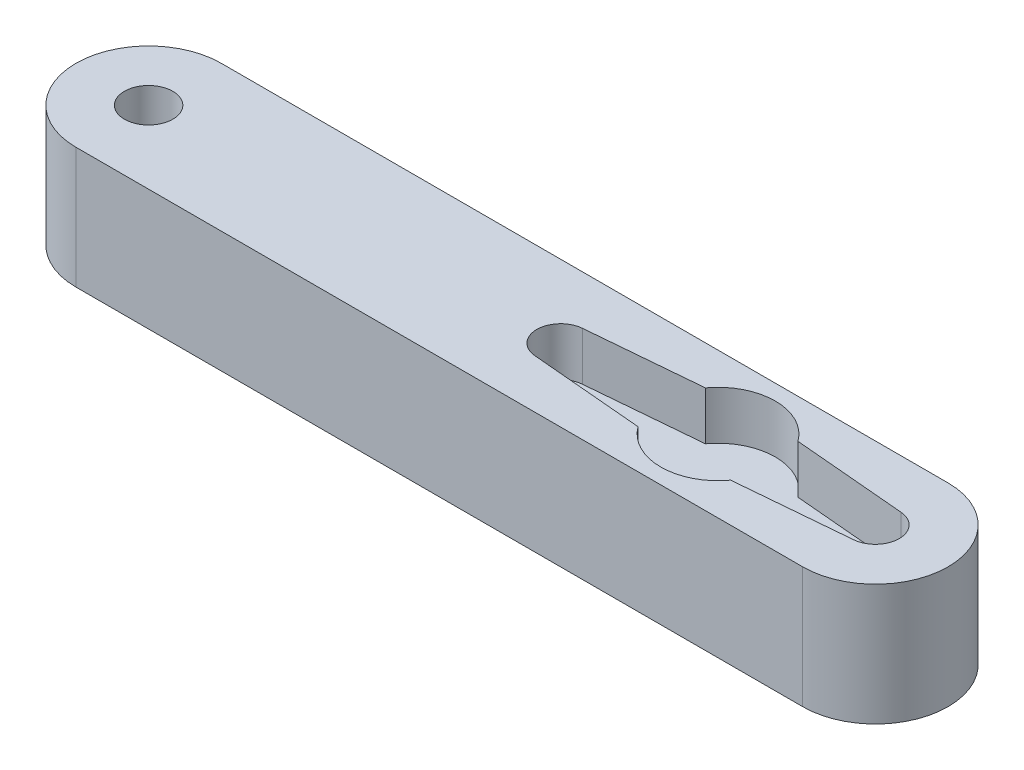
ISO-10303-21;
HEADER;
FILE_DESCRIPTION(('STEP AP214'),'2;1');
FILE_NAME('part.step','',(''),(''),'','','');
FILE_SCHEMA(('AUTOMOTIVE_DESIGN { 1 0 10303 214 1 1 1 1 }'));
ENDSEC;
DATA;
#1=APPLICATION_CONTEXT('core data for automotive mechanical design processes');
#2=APPLICATION_PROTOCOL_DEFINITION('international standard','automotive_design',2000,#1);
#3=PRODUCT_CONTEXT('',#1,'mechanical');
#4=PRODUCT('Part','Part','',(#3));
#5=PRODUCT_RELATED_PRODUCT_CATEGORY('part','',(#4));
#6=PRODUCT_DEFINITION_FORMATION('','',#4);
#7=PRODUCT_DEFINITION_CONTEXT('part definition',#1,'design');
#8=PRODUCT_DEFINITION('design','',#6,#7);
#9=PRODUCT_DEFINITION_SHAPE('','',#8);
#10=(LENGTH_UNIT() NAMED_UNIT(*) SI_UNIT(.MILLI.,.METRE.));
#11=(NAMED_UNIT(*) PLANE_ANGLE_UNIT() SI_UNIT($,.RADIAN.));
#12=(NAMED_UNIT(*) SI_UNIT($,.STERADIAN.) SOLID_ANGLE_UNIT());
#13=UNCERTAINTY_MEASURE_WITH_UNIT(LENGTH_MEASURE(1.E-05),#10,'distance_accuracy_value','');
#14=(GEOMETRIC_REPRESENTATION_CONTEXT(3) GLOBAL_UNCERTAINTY_ASSIGNED_CONTEXT((#13)) GLOBAL_UNIT_ASSIGNED_CONTEXT((#10,
#11,#12)) REPRESENTATION_CONTEXT('',''));
#15=CARTESIAN_POINT('',(0.,0.,0.));
#16=DIRECTION('',(0.,0.,1.));
#17=DIRECTION('',(1.,0.,0.));
#18=AXIS2_PLACEMENT_3D('',#15,#16,#17);
#19=CARTESIAN_POINT('',(-31.75,12.7,0.));
#20=DIRECTION('',(0.,1.,0.));
#21=DIRECTION('',(0.,0.,1.));
#22=AXIS2_PLACEMENT_3D('',#19,#20,#21);
#23=PLANE('',#22);
#24=CARTESIAN_POINT('',(-31.75,12.7,0.));
#25=DIRECTION('',(0.,1.,0.));
#26=DIRECTION('',(0.,0.,1.));
#27=AXIS2_PLACEMENT_3D('',#24,#25,#26);
#28=CIRCLE('',#27,2.54);
#29=CARTESIAN_POINT('',(-31.75,12.7,2.54));
#30=VERTEX_POINT('',#29);
#31=EDGE_CURVE('E161',#30,#30,#28,.T.);
#32=ORIENTED_EDGE('',*,*,#31,.F.);
#33=EDGE_LOOP('',(#32));
#34=FACE_BOUND('',#33,.T.);
#35=CARTESIAN_POINT('',(-31.75,12.7,0.));
#36=DIRECTION('',(0.,1.,0.));
#37=DIRECTION('',(0.,0.,1.));
#38=AXIS2_PLACEMENT_3D('',#35,#36,#37);
#39=CIRCLE('',#38,7.62);
#40=CARTESIAN_POINT('',(-31.75,12.7,-7.62));
#41=VERTEX_POINT('',#40);
#42=CARTESIAN_POINT('',(-31.75,12.7,7.62));
#43=VERTEX_POINT('',#42);
#44=EDGE_CURVE('E174',#41,#43,#39,.T.);
#45=ORIENTED_EDGE('',*,*,#44,.T.);
#46=DIRECTION('',(1.,0.,0.));
#47=VECTOR('',#46,1.);
#48=CARTESIAN_POINT('',(-31.75,12.7,7.62));
#49=LINE('',#48,#47);
#50=CARTESIAN_POINT('',(44.45,12.7,7.62));
#51=VERTEX_POINT('',#50);
#52=EDGE_CURVE('E93',#43,#51,#49,.T.);
#53=ORIENTED_EDGE('',*,*,#52,.T.);
#54=CARTESIAN_POINT('',(44.45,12.7,0.));
#55=DIRECTION('',(0.,1.,0.));
#56=DIRECTION('',(0.,0.,1.));
#57=AXIS2_PLACEMENT_3D('',#54,#55,#56);
#58=CIRCLE('',#57,7.62);
#59=CARTESIAN_POINT('',(44.45,12.7,-7.62));
#60=VERTEX_POINT('',#59);
#61=EDGE_CURVE('E177',#51,#60,#58,.T.);
#62=ORIENTED_EDGE('',*,*,#61,.T.);
#63=DIRECTION('',(-1.,0.,0.));
#64=VECTOR('',#63,1.);
#65=CARTESIAN_POINT('',(-31.75,12.7,-7.62));
#66=LINE('',#65,#64);
#67=EDGE_CURVE('E65',#60,#41,#66,.T.);
#68=ORIENTED_EDGE('',*,*,#67,.T.);
#69=EDGE_LOOP('',(#45,#53,#62,#68));
#70=FACE_BOUND('',#69,.T.);
#71=DIRECTION('',(-0.996194698091746,0.,-0.0871557427476515));
#72=VECTOR('',#71,1.);
#73=CARTESIAN_POINT('',(44.6678893568691,12.7,-2.49048674522936));
#74=LINE('',#73,#72);
#75=CARTESIAN_POINT('',(44.6678893568691,12.7,-2.49048674522937));
#76=VERTEX_POINT('',#75);
#77=CARTESIAN_POINT('',(32.8027652632598,12.7,-3.52855059474841));
#78=VERTEX_POINT('',#77);
#79=EDGE_CURVE('E156',#76,#78,#74,.T.);
#80=ORIENTED_EDGE('',*,*,#79,.F.);
#81=CARTESIAN_POINT('',(44.45,12.7,0.));
#82=DIRECTION('',(0.,-1.,0.));
#83=DIRECTION('',(0.,0.,-1.));
#84=AXIS2_PLACEMENT_3D('',#81,#82,#83);
#85=CIRCLE('',#84,2.5);
#86=CARTESIAN_POINT('',(44.6678893568691,12.7,2.49048674522936));
#87=VERTEX_POINT('',#86);
#88=EDGE_CURVE('E56',#76,#87,#85,.T.);
#89=ORIENTED_EDGE('',*,*,#88,.T.);
#90=DIRECTION('',(-0.996194698091746,0.,0.0871557427476513));
#91=VECTOR('',#90,1.);
#92=CARTESIAN_POINT('',(44.6678893568691,12.7,2.49048674522936));
#93=LINE('',#92,#91);
#94=CARTESIAN_POINT('',(32.8027652632598,12.7,3.52855059474841));
#95=VERTEX_POINT('',#94);
#96=EDGE_CURVE('E160',#87,#95,#93,.T.);
#97=ORIENTED_EDGE('',*,*,#96,.T.);
#98=CARTESIAN_POINT('',(27.95,12.7,0.));
#99=DIRECTION('',(0.,1.,0.));
#100=DIRECTION('',(0.,0.,1.));
#101=AXIS2_PLACEMENT_3D('',#98,#99,#100);
#102=CIRCLE('',#101,6.);
#103=CARTESIAN_POINT('',(23.0972347367402,12.7,3.5285505947484));
#104=VERTEX_POINT('',#103);
#105=EDGE_CURVE('E377',#104,#95,#102,.T.);
#106=ORIENTED_EDGE('',*,*,#105,.F.);
#107=DIRECTION('',(0.996194698091746,0.,0.0871557427476513));
#108=VECTOR('',#107,1.);
#109=CARTESIAN_POINT('',(11.2321106431309,12.7,2.49048674522936));
#110=LINE('',#109,#108);
#111=CARTESIAN_POINT('',(11.2321106431309,12.7,2.49048674522936));
#112=VERTEX_POINT('',#111);
#113=EDGE_CURVE('E380',#112,#104,#110,.T.);
#114=ORIENTED_EDGE('',*,*,#113,.F.);
#115=CARTESIAN_POINT('',(11.45,12.7,0.));
#116=DIRECTION('',(0.,1.,0.));
#117=DIRECTION('',(0.,0.,1.));
#118=AXIS2_PLACEMENT_3D('',#115,#116,#117);
#119=CIRCLE('',#118,2.5);
#120=CARTESIAN_POINT('',(11.2321106431309,12.7,-2.49048674522936));
#121=VERTEX_POINT('',#120);
#122=EDGE_CURVE('E362',#121,#112,#119,.T.);
#123=ORIENTED_EDGE('',*,*,#122,.F.);
#124=DIRECTION('',(0.996194698091746,0.,-0.0871557427476516));
#125=VECTOR('',#124,1.);
#126=CARTESIAN_POINT('',(11.2321106431309,12.7,-2.49048674522936));
#127=LINE('',#126,#125);
#128=CARTESIAN_POINT('',(23.0972347367402,12.7,-3.52855059474841));
#129=VERTEX_POINT('',#128);
#130=EDGE_CURVE('E359',#121,#129,#127,.T.);
#131=ORIENTED_EDGE('',*,*,#130,.T.);
#132=CARTESIAN_POINT('',(27.95,12.7,0.));
#133=DIRECTION('',(0.,1.,0.));
#134=DIRECTION('',(0.,0.,1.));
#135=AXIS2_PLACEMENT_3D('',#132,#133,#134);
#136=CIRCLE('',#135,6.);
#137=EDGE_CURVE('E353',#78,#129,#136,.T.);
#138=ORIENTED_EDGE('',*,*,#137,.F.);
#139=EDGE_LOOP('',(#80,#89,#97,#106,#114,#123,#131,#138));
#140=FACE_BOUND('',#139,.T.);
#141=ADVANCED_FACE('F41',(#34,#70,#140),#23,.T.);
#142=CARTESIAN_POINT('',(-31.75,12.7,0.));
#143=DIRECTION('',(0.,-1.,0.));
#144=DIRECTION('',(0.,0.,-1.));
#145=AXIS2_PLACEMENT_3D('',#142,#143,#144);
#146=CYLINDRICAL_SURFACE('',#145,7.62);
#147=CARTESIAN_POINT('',(-31.75,0.,0.));
#148=DIRECTION('',(0.,1.,0.));
#149=DIRECTION('',(0.,0.,1.));
#150=AXIS2_PLACEMENT_3D('',#147,#148,#149);
#151=CIRCLE('',#150,7.62);
#152=CARTESIAN_POINT('',(-31.75,0.,-7.62));
#153=VERTEX_POINT('',#152);
#154=CARTESIAN_POINT('',(-31.75,0.,7.62));
#155=VERTEX_POINT('',#154);
#156=EDGE_CURVE('E172',#153,#155,#151,.T.);
#157=ORIENTED_EDGE('',*,*,#156,.T.);
#158=DIRECTION('',(0.,-1.,0.));
#159=VECTOR('',#158,1.);
#160=CARTESIAN_POINT('',(-31.75,12.7,7.62));
#161=LINE('',#160,#159);
#162=EDGE_CURVE('E11',#43,#155,#161,.T.);
#163=ORIENTED_EDGE('',*,*,#162,.F.);
#164=ORIENTED_EDGE('',*,*,#44,.F.);
#165=DIRECTION('',(0.,-1.,0.));
#166=VECTOR('',#165,1.);
#167=CARTESIAN_POINT('',(-31.75,12.7,-7.62));
#168=LINE('',#167,#166);
#169=EDGE_CURVE('E180',#41,#153,#168,.T.);
#170=ORIENTED_EDGE('',*,*,#169,.T.);
#171=EDGE_LOOP('',(#157,#163,#164,#170));
#172=FACE_BOUND('',#171,.T.);
#173=ADVANCED_FACE('F43',(#172),#146,.T.);
#174=CARTESIAN_POINT('',(-31.75,12.7,7.62));
#175=DIRECTION('',(0.,0.,-1.));
#176=DIRECTION('',(-1.,0.,0.));
#177=AXIS2_PLACEMENT_3D('',#174,#175,#176);
#178=PLANE('',#177);
#179=DIRECTION('',(1.,0.,0.));
#180=VECTOR('',#179,1.);
#181=CARTESIAN_POINT('',(-31.75,0.,7.62));
#182=LINE('',#181,#180);
#183=CARTESIAN_POINT('',(44.45,0.,7.62));
#184=VERTEX_POINT('',#183);
#185=EDGE_CURVE('E183',#155,#184,#182,.T.);
#186=ORIENTED_EDGE('',*,*,#185,.T.);
#187=DIRECTION('',(0.,-1.,0.));
#188=VECTOR('',#187,1.);
#189=CARTESIAN_POINT('',(44.45,12.7,7.62));
#190=LINE('',#189,#188);
#191=EDGE_CURVE('E49',#51,#184,#190,.T.);
#192=ORIENTED_EDGE('',*,*,#191,.F.);
#193=ORIENTED_EDGE('',*,*,#52,.F.);
#194=ORIENTED_EDGE('',*,*,#162,.T.);
#195=EDGE_LOOP('',(#186,#192,#193,#194));
#196=FACE_BOUND('',#195,.T.);
#197=ADVANCED_FACE('F212',(#196),#178,.F.);
#198=CARTESIAN_POINT('',(44.45,12.7,0.));
#199=DIRECTION('',(0.,-1.,0.));
#200=DIRECTION('',(0.,0.,-1.));
#201=AXIS2_PLACEMENT_3D('',#198,#199,#200);
#202=CYLINDRICAL_SURFACE('',#201,7.62);
#203=CARTESIAN_POINT('',(44.45,0.,0.));
#204=DIRECTION('',(0.,1.,0.));
#205=DIRECTION('',(0.,0.,1.));
#206=AXIS2_PLACEMENT_3D('',#203,#204,#205);
#207=CIRCLE('',#206,7.62);
#208=CARTESIAN_POINT('',(44.45,0.,-7.62));
#209=VERTEX_POINT('',#208);
#210=EDGE_CURVE('E185',#184,#209,#207,.T.);
#211=ORIENTED_EDGE('',*,*,#210,.T.);
#212=DIRECTION('',(0.,-1.,0.));
#213=VECTOR('',#212,1.);
#214=CARTESIAN_POINT('',(44.45,12.7,-7.62));
#215=LINE('',#214,#213);
#216=EDGE_CURVE('E189',#60,#209,#215,.T.);
#217=ORIENTED_EDGE('',*,*,#216,.F.);
#218=ORIENTED_EDGE('',*,*,#61,.F.);
#219=ORIENTED_EDGE('',*,*,#191,.T.);
#220=EDGE_LOOP('',(#211,#217,#218,#219));
#221=FACE_BOUND('',#220,.T.);
#222=ADVANCED_FACE('F194',(#221),#202,.T.);
#223=CARTESIAN_POINT('',(-31.75,12.7,-7.62));
#224=DIRECTION('',(0.,0.,1.));
#225=DIRECTION('',(1.,0.,0.));
#226=AXIS2_PLACEMENT_3D('',#223,#224,#225);
#227=PLANE('',#226);
#228=DIRECTION('',(-1.,0.,0.));
#229=VECTOR('',#228,1.);
#230=CARTESIAN_POINT('',(-31.75,0.,-7.62));
#231=LINE('',#230,#229);
#232=EDGE_CURVE('E86',#209,#153,#231,.T.);
#233=ORIENTED_EDGE('',*,*,#232,.T.);
#234=ORIENTED_EDGE('',*,*,#169,.F.);
#235=ORIENTED_EDGE('',*,*,#67,.F.);
#236=ORIENTED_EDGE('',*,*,#216,.T.);
#237=EDGE_LOOP('',(#233,#234,#235,#236));
#238=FACE_BOUND('',#237,.T.);
#239=ADVANCED_FACE('F202',(#238),#227,.F.);
#240=CARTESIAN_POINT('',(-31.75,0.,0.));
#241=DIRECTION('',(0.,1.,0.));
#242=DIRECTION('',(0.,0.,1.));
#243=AXIS2_PLACEMENT_3D('',#240,#241,#242);
#244=PLANE('',#243);
#245=CARTESIAN_POINT('',(-31.75,0.,0.));
#246=DIRECTION('',(0.,1.,0.));
#247=DIRECTION('',(0.,0.,1.));
#248=AXIS2_PLACEMENT_3D('',#245,#246,#247);
#249=CIRCLE('',#248,2.54);
#250=CARTESIAN_POINT('',(-31.75,0.,2.54));
#251=VERTEX_POINT('',#250);
#252=EDGE_CURVE('E165',#251,#251,#249,.T.);
#253=ORIENTED_EDGE('',*,*,#252,.T.);
#254=EDGE_LOOP('',(#253));
#255=FACE_BOUND('',#254,.T.);
#256=ORIENTED_EDGE('',*,*,#156,.F.);
#257=ORIENTED_EDGE('',*,*,#232,.F.);
#258=ORIENTED_EDGE('',*,*,#210,.F.);
#259=ORIENTED_EDGE('',*,*,#185,.F.);
#260=EDGE_LOOP('',(#256,#257,#258,#259));
#261=FACE_BOUND('',#260,.T.);
#262=ADVANCED_FACE('F198',(#255,#261),#244,.F.);
#263=CARTESIAN_POINT('',(-31.75,0.,0.));
#264=DIRECTION('',(0.,1.,0.));
#265=DIRECTION('',(0.,0.,1.));
#266=AXIS2_PLACEMENT_3D('',#263,#264,#265);
#267=CYLINDRICAL_SURFACE('',#266,2.54);
#268=ORIENTED_EDGE('',*,*,#252,.F.);
#269=EDGE_LOOP('',(#268));
#270=FACE_BOUND('',#269,.T.);
#271=ORIENTED_EDGE('',*,*,#31,.T.);
#272=EDGE_LOOP('',(#271));
#273=FACE_BOUND('',#272,.T.);
#274=ADVANCED_FACE('F209',(#270,#273),#267,.F.);
#275=CARTESIAN_POINT('',(44.45,7.62,0.));
#276=DIRECTION('',(0.,1.,0.));
#277=DIRECTION('',(0.,0.,1.));
#278=AXIS2_PLACEMENT_3D('',#275,#276,#277);
#279=CYLINDRICAL_SURFACE('',#278,2.5);
#280=ORIENTED_EDGE('',*,*,#88,.F.);
#281=DIRECTION('',(0.,1.,0.));
#282=VECTOR('',#281,1.);
#283=CARTESIAN_POINT('',(44.6678893568691,7.62,-2.49048674522936));
#284=LINE('',#283,#282);
#285=CARTESIAN_POINT('',(44.6678893568691,7.62,-2.49048674522936));
#286=VERTEX_POINT('',#285);
#287=EDGE_CURVE('E155',#286,#76,#284,.T.);
#288=ORIENTED_EDGE('',*,*,#287,.F.);
#289=CARTESIAN_POINT('',(44.45,7.62,0.));
#290=DIRECTION('',(0.,-1.,0.));
#291=DIRECTION('',(0.,0.,-1.));
#292=AXIS2_PLACEMENT_3D('',#289,#290,#291);
#293=CIRCLE('',#292,2.5);
#294=CARTESIAN_POINT('',(44.6678893568691,7.62,2.49048674522936));
#295=VERTEX_POINT('',#294);
#296=EDGE_CURVE('E144',#286,#295,#293,.T.);
#297=ORIENTED_EDGE('',*,*,#296,.T.);
#298=DIRECTION('',(0.,1.,0.));
#299=VECTOR('',#298,1.);
#300=CARTESIAN_POINT('',(44.6678893568691,7.62,2.49048674522936));
#301=LINE('',#300,#299);
#302=EDGE_CURVE('E154',#295,#87,#301,.T.);
#303=ORIENTED_EDGE('',*,*,#302,.T.);
#304=EDGE_LOOP('',(#280,#288,#297,#303));
#305=FACE_BOUND('',#304,.T.);
#306=ADVANCED_FACE('F153',(#305),#279,.F.);
#307=CARTESIAN_POINT('',(44.6678893568691,7.62,2.49048674522936));
#308=DIRECTION('',(-0.0871557427476513,0.,-0.996194698091746));
#309=DIRECTION('',(-0.996194698091746,0.,0.0871557427476514));
#310=AXIS2_PLACEMENT_3D('',#307,#308,#309);
#311=PLANE('',#310);
#312=ORIENTED_EDGE('',*,*,#96,.F.);
#313=ORIENTED_EDGE('',*,*,#302,.F.);
#314=DIRECTION('',(-0.996194698091746,0.,0.0871557427476513));
#315=VECTOR('',#314,1.);
#316=CARTESIAN_POINT('',(44.6678893568691,7.62,2.49048674522936));
#317=LINE('',#316,#315);
#318=CARTESIAN_POINT('',(32.8027652632598,7.62,3.52855059474841));
#319=VERTEX_POINT('',#318);
#320=EDGE_CURVE('E140',#295,#319,#317,.T.);
#321=ORIENTED_EDGE('',*,*,#320,.T.);
#322=DIRECTION('',(0.,1.,0.));
#323=VECTOR('',#322,1.);
#324=CARTESIAN_POINT('',(32.8027652632598,7.62,3.52855059474841));
#325=LINE('',#324,#323);
#326=EDGE_CURVE('E162',#319,#95,#325,.T.);
#327=ORIENTED_EDGE('',*,*,#326,.T.);
#328=EDGE_LOOP('',(#312,#313,#321,#327));
#329=FACE_BOUND('',#328,.T.);
#330=ADVANCED_FACE('F158',(#329),#311,.T.);
#331=CARTESIAN_POINT('',(27.95,7.62,0.));
#332=DIRECTION('',(0.,1.,0.));
#333=DIRECTION('',(0.,0.,1.));
#334=AXIS2_PLACEMENT_3D('',#331,#332,#333);
#335=CYLINDRICAL_SURFACE('',#334,6.);
#336=ORIENTED_EDGE('',*,*,#105,.T.);
#337=ORIENTED_EDGE('',*,*,#326,.F.);
#338=CARTESIAN_POINT('',(27.95,7.62,0.));
#339=DIRECTION('',(0.,1.,0.));
#340=DIRECTION('',(0.,0.,1.));
#341=AXIS2_PLACEMENT_3D('',#338,#339,#340);
#342=CIRCLE('',#341,6.);
#343=CARTESIAN_POINT('',(23.0972347367402,7.62,3.5285505947484));
#344=VERTEX_POINT('',#343);
#345=EDGE_CURVE('E148',#344,#319,#342,.T.);
#346=ORIENTED_EDGE('',*,*,#345,.F.);
#347=DIRECTION('',(0.,1.,0.));
#348=VECTOR('',#347,1.);
#349=CARTESIAN_POINT('',(23.0972347367402,7.62,3.5285505947484));
#350=LINE('',#349,#348);
#351=EDGE_CURVE('E167',#344,#104,#350,.T.);
#352=ORIENTED_EDGE('',*,*,#351,.T.);
#353=EDGE_LOOP('',(#336,#337,#346,#352));
#354=FACE_BOUND('',#353,.T.);
#355=ADVANCED_FACE('F229',(#354),#335,.F.);
#356=CARTESIAN_POINT('',(11.2321106431309,7.62,2.49048674522936));
#357=DIRECTION('',(-0.0871557427476513,0.,0.996194698091746));
#358=DIRECTION('',(0.996194698091746,0.,0.0871557427476514));
#359=AXIS2_PLACEMENT_3D('',#356,#357,#358);
#360=PLANE('',#359);
#361=ORIENTED_EDGE('',*,*,#113,.T.);
#362=ORIENTED_EDGE('',*,*,#351,.F.);
#363=DIRECTION('',(0.996194698091746,0.,0.0871557427476513));
#364=VECTOR('',#363,1.);
#365=CARTESIAN_POINT('',(11.2321106431309,7.62,2.49048674522936));
#366=LINE('',#365,#364);
#367=CARTESIAN_POINT('',(11.2321106431309,7.62,2.49048674522936));
#368=VERTEX_POINT('',#367);
#369=EDGE_CURVE('E398',#368,#344,#366,.T.);
#370=ORIENTED_EDGE('',*,*,#369,.F.);
#371=DIRECTION('',(0.,1.,0.));
#372=VECTOR('',#371,1.);
#373=CARTESIAN_POINT('',(11.2321106431309,7.62,2.49048674522936));
#374=LINE('',#373,#372);
#375=EDGE_CURVE('E373',#368,#112,#374,.T.);
#376=ORIENTED_EDGE('',*,*,#375,.T.);
#377=EDGE_LOOP('',(#361,#362,#370,#376));
#378=FACE_BOUND('',#377,.T.);
#379=ADVANCED_FACE('F232',(#378),#360,.F.);
#380=CARTESIAN_POINT('',(11.45,7.62,0.));
#381=DIRECTION('',(0.,1.,0.));
#382=DIRECTION('',(0.,0.,1.));
#383=AXIS2_PLACEMENT_3D('',#380,#381,#382);
#384=CYLINDRICAL_SURFACE('',#383,2.5);
#385=ORIENTED_EDGE('',*,*,#122,.T.);
#386=ORIENTED_EDGE('',*,*,#375,.F.);
#387=CARTESIAN_POINT('',(11.45,7.62,0.));
#388=DIRECTION('',(0.,1.,0.));
#389=DIRECTION('',(0.,0.,1.));
#390=AXIS2_PLACEMENT_3D('',#387,#388,#389);
#391=CIRCLE('',#390,2.5);
#392=CARTESIAN_POINT('',(11.2321106431309,7.62,-2.49048674522936));
#393=VERTEX_POINT('',#392);
#394=EDGE_CURVE('E388',#393,#368,#391,.T.);
#395=ORIENTED_EDGE('',*,*,#394,.F.);
#396=DIRECTION('',(0.,1.,0.));
#397=VECTOR('',#396,1.);
#398=CARTESIAN_POINT('',(11.2321106431309,7.62,-2.49048674522936));
#399=LINE('',#398,#397);
#400=EDGE_CURVE('E371',#393,#121,#399,.T.);
#401=ORIENTED_EDGE('',*,*,#400,.T.);
#402=EDGE_LOOP('',(#385,#386,#395,#401));
#403=FACE_BOUND('',#402,.T.);
#404=ADVANCED_FACE('F236',(#403),#384,.F.);
#405=CARTESIAN_POINT('',(11.2321106431309,7.62,-2.49048674522936));
#406=DIRECTION('',(0.0871557427476516,0.,0.996194698091746));
#407=DIRECTION('',(0.996194698091746,0.,-0.0871557427476516));
#408=AXIS2_PLACEMENT_3D('',#405,#406,#407);
#409=PLANE('',#408);
#410=ORIENTED_EDGE('',*,*,#130,.F.);
#411=ORIENTED_EDGE('',*,*,#400,.F.);
#412=DIRECTION('',(0.996194698091746,0.,-0.0871557427476516));
#413=VECTOR('',#412,1.);
#414=CARTESIAN_POINT('',(11.2321106431309,7.62,-2.49048674522936));
#415=LINE('',#414,#413);
#416=CARTESIAN_POINT('',(23.0972347367402,7.62,-3.52855059474841));
#417=VERTEX_POINT('',#416);
#418=EDGE_CURVE('E390',#393,#417,#415,.T.);
#419=ORIENTED_EDGE('',*,*,#418,.T.);
#420=DIRECTION('',(0.,1.,0.));
#421=VECTOR('',#420,1.);
#422=CARTESIAN_POINT('',(23.0972347367402,7.62,-3.52855059474841));
#423=LINE('',#422,#421);
#424=EDGE_CURVE('E369',#417,#129,#423,.T.);
#425=ORIENTED_EDGE('',*,*,#424,.T.);
#426=EDGE_LOOP('',(#410,#411,#419,#425));
#427=FACE_BOUND('',#426,.T.);
#428=ADVANCED_FACE('F240',(#427),#409,.T.);
#429=CARTESIAN_POINT('',(27.95,7.62,0.));
#430=DIRECTION('',(0.,1.,0.));
#431=DIRECTION('',(0.,0.,1.));
#432=AXIS2_PLACEMENT_3D('',#429,#430,#431);
#433=CYLINDRICAL_SURFACE('',#432,6.);
#434=ORIENTED_EDGE('',*,*,#137,.T.);
#435=ORIENTED_EDGE('',*,*,#424,.F.);
#436=CARTESIAN_POINT('',(27.95,7.62,0.));
#437=DIRECTION('',(0.,1.,0.));
#438=DIRECTION('',(0.,0.,1.));
#439=AXIS2_PLACEMENT_3D('',#436,#437,#438);
#440=CIRCLE('',#439,6.);
#441=CARTESIAN_POINT('',(32.8027652632598,7.62,-3.52855059474841));
#442=VERTEX_POINT('',#441);
#443=EDGE_CURVE('E392',#442,#417,#440,.T.);
#444=ORIENTED_EDGE('',*,*,#443,.F.);
#445=DIRECTION('',(0.,1.,0.));
#446=VECTOR('',#445,1.);
#447=CARTESIAN_POINT('',(32.8027652632598,7.62,-3.52855059474841));
#448=LINE('',#447,#446);
#449=EDGE_CURVE('E350',#442,#78,#448,.T.);
#450=ORIENTED_EDGE('',*,*,#449,.T.);
#451=EDGE_LOOP('',(#434,#435,#444,#450));
#452=FACE_BOUND('',#451,.T.);
#453=ADVANCED_FACE('F244',(#452),#433,.F.);
#454=CARTESIAN_POINT('',(44.6678893568691,7.62,-2.49048674522936));
#455=DIRECTION('',(0.0871557427476515,0.,-0.996194698091746));
#456=DIRECTION('',(-0.996194698091746,0.,-0.0871557427476515));
#457=AXIS2_PLACEMENT_3D('',#454,#455,#456);
#458=PLANE('',#457);
#459=ORIENTED_EDGE('',*,*,#79,.T.);
#460=ORIENTED_EDGE('',*,*,#449,.F.);
#461=DIRECTION('',(-0.996194698091746,0.,-0.0871557427476515));
#462=VECTOR('',#461,1.);
#463=CARTESIAN_POINT('',(44.6678893568691,7.62,-2.49048674522936));
#464=LINE('',#463,#462);
#465=EDGE_CURVE('E367',#286,#442,#464,.T.);
#466=ORIENTED_EDGE('',*,*,#465,.F.);
#467=ORIENTED_EDGE('',*,*,#287,.T.);
#468=EDGE_LOOP('',(#459,#460,#466,#467));
#469=FACE_BOUND('',#468,.T.);
#470=ADVANCED_FACE('F248',(#469),#458,.F.);
#471=CARTESIAN_POINT('',(44.45,7.62,0.));
#472=DIRECTION('',(0.,-1.,0.));
#473=DIRECTION('',(0.,0.,-1.));
#474=AXIS2_PLACEMENT_3D('',#471,#472,#473);
#475=PLANE('',#474);
#476=ORIENTED_EDGE('',*,*,#296,.F.);
#477=ORIENTED_EDGE('',*,*,#465,.T.);
#478=ORIENTED_EDGE('',*,*,#443,.T.);
#479=ORIENTED_EDGE('',*,*,#418,.F.);
#480=ORIENTED_EDGE('',*,*,#394,.T.);
#481=ORIENTED_EDGE('',*,*,#369,.T.);
#482=ORIENTED_EDGE('',*,*,#345,.T.);
#483=ORIENTED_EDGE('',*,*,#320,.F.);
#484=EDGE_LOOP('',(#476,#477,#478,#479,#480,#481,#482,#483));
#485=FACE_BOUND('',#484,.T.);
#486=ADVANCED_FACE('F142',(#485),#475,.F.);
#487=CLOSED_SHELL('',(#141,#173,#197,#222,#239,#262,#274,#306,#330,#355,#379,#404,#428,#453,
#470,#486));
#488=MANIFOLD_SOLID_BREP('B2',#487);
#489=ADVANCED_BREP_SHAPE_REPRESENTATION('',(#18,#488),#14);
#490=SHAPE_DEFINITION_REPRESENTATION(#9,#489);
ENDSEC;
END-ISO-10303-21;
